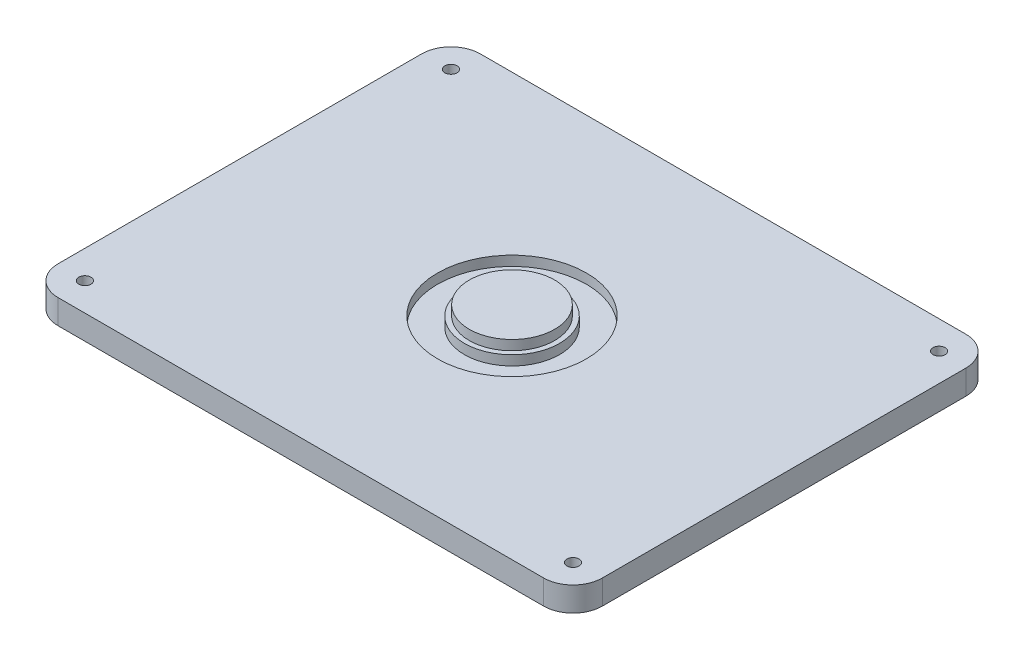
ISO-10303-21;
HEADER;
FILE_DESCRIPTION(('STEP AP214'),'2;1');
FILE_NAME('part.step','',(''),(''),'','','');
FILE_SCHEMA(('AUTOMOTIVE_DESIGN { 1 0 10303 214 1 1 1 1 }'));
ENDSEC;
DATA;
#1=APPLICATION_CONTEXT('core data for automotive mechanical design processes');
#2=APPLICATION_PROTOCOL_DEFINITION('international standard','automotive_design',2000,#1);
#3=PRODUCT_CONTEXT('',#1,'mechanical');
#4=PRODUCT('Part','Part','',(#3));
#5=PRODUCT_RELATED_PRODUCT_CATEGORY('part','',(#4));
#6=PRODUCT_DEFINITION_FORMATION('','',#4);
#7=PRODUCT_DEFINITION_CONTEXT('part definition',#1,'design');
#8=PRODUCT_DEFINITION('design','',#6,#7);
#9=PRODUCT_DEFINITION_SHAPE('','',#8);
#10=(LENGTH_UNIT() NAMED_UNIT(*) SI_UNIT(.MILLI.,.METRE.));
#11=(NAMED_UNIT(*) PLANE_ANGLE_UNIT() SI_UNIT($,.RADIAN.));
#12=(NAMED_UNIT(*) SI_UNIT($,.STERADIAN.) SOLID_ANGLE_UNIT());
#13=UNCERTAINTY_MEASURE_WITH_UNIT(LENGTH_MEASURE(1.E-05),#10,'distance_accuracy_value','');
#14=(GEOMETRIC_REPRESENTATION_CONTEXT(3) GLOBAL_UNCERTAINTY_ASSIGNED_CONTEXT((#13)) GLOBAL_UNIT_ASSIGNED_CONTEXT((#10,
#11,#12)) REPRESENTATION_CONTEXT('',''));
#15=CARTESIAN_POINT('',(0.,0.,0.));
#16=DIRECTION('',(0.,0.,1.));
#17=DIRECTION('',(1.,0.,0.));
#18=AXIS2_PLACEMENT_3D('',#15,#16,#17);
#19=CARTESIAN_POINT('',(99.5,-10.,74.5));
#20=DIRECTION('',(0.,1.,0.));
#21=DIRECTION('',(0.,0.,1.));
#22=AXIS2_PLACEMENT_3D('',#19,#20,#21);
#23=CYLINDRICAL_SURFACE('',#22,12.);
#24=CARTESIAN_POINT('',(99.5,0.,74.5));
#25=DIRECTION('',(0.,1.,0.));
#26=DIRECTION('',(0.,0.,1.));
#27=AXIS2_PLACEMENT_3D('',#24,#25,#26);
#28=CIRCLE('',#27,12.);
#29=CARTESIAN_POINT('',(99.4999999999999,0.,86.5));
#30=VERTEX_POINT('',#29);
#31=CARTESIAN_POINT('',(111.5,0.,74.4999999999999));
#32=VERTEX_POINT('',#31);
#33=EDGE_CURVE('E144',#30,#32,#28,.T.);
#34=ORIENTED_EDGE('',*,*,#33,.F.);
#35=DIRECTION('',(0.,1.,0.));
#36=VECTOR('',#35,1.);
#37=CARTESIAN_POINT('',(99.4999999999999,-10.,86.5));
#38=LINE('',#37,#36);
#39=CARTESIAN_POINT('',(99.4999999999999,-10.,86.5));
#40=VERTEX_POINT('',#39);
#41=EDGE_CURVE('E49',#40,#30,#38,.T.);
#42=ORIENTED_EDGE('',*,*,#41,.F.);
#43=CARTESIAN_POINT('',(99.5,-10.,74.5));
#44=DIRECTION('',(0.,1.,0.));
#45=DIRECTION('',(0.,0.,1.));
#46=AXIS2_PLACEMENT_3D('',#43,#44,#45);
#47=CIRCLE('',#46,12.);
#48=CARTESIAN_POINT('',(111.5,-10.,74.4999999999999));
#49=VERTEX_POINT('',#48);
#50=EDGE_CURVE('E174',#40,#49,#47,.T.);
#51=ORIENTED_EDGE('',*,*,#50,.T.);
#52=DIRECTION('',(0.,1.,0.));
#53=VECTOR('',#52,1.);
#54=CARTESIAN_POINT('',(111.5,-10.,74.4999999999999));
#55=LINE('',#54,#53);
#56=EDGE_CURVE('E42',#49,#32,#55,.T.);
#57=ORIENTED_EDGE('',*,*,#56,.T.);
#58=EDGE_LOOP('',(#34,#42,#51,#57));
#59=FACE_BOUND('',#58,.T.);
#60=ADVANCED_FACE('F39',(#59),#23,.T.);
#61=CARTESIAN_POINT('',(-99.4999999999999,-10.,86.5));
#62=DIRECTION('',(0.,0.,1.));
#63=DIRECTION('',(1.,0.,0.));
#64=AXIS2_PLACEMENT_3D('',#61,#62,#63);
#65=PLANE('',#64);
#66=DIRECTION('',(1.,0.,0.));
#67=VECTOR('',#66,1.);
#68=CARTESIAN_POINT('',(-99.4999999999999,0.,86.5));
#69=LINE('',#68,#67);
#70=CARTESIAN_POINT('',(-99.4999999999999,0.,86.5));
#71=VERTEX_POINT('',#70);
#72=EDGE_CURVE('E170',#71,#30,#69,.T.);
#73=ORIENTED_EDGE('',*,*,#72,.F.);
#74=DIRECTION('',(0.,1.,0.));
#75=VECTOR('',#74,1.);
#76=CARTESIAN_POINT('',(-99.4999999999999,-10.,86.5));
#77=LINE('',#76,#75);
#78=CARTESIAN_POINT('',(-99.4999999999999,-10.,86.5));
#79=VERTEX_POINT('',#78);
#80=EDGE_CURVE('E86',#79,#71,#77,.T.);
#81=ORIENTED_EDGE('',*,*,#80,.F.);
#82=DIRECTION('',(1.,0.,0.));
#83=VECTOR('',#82,1.);
#84=CARTESIAN_POINT('',(-99.4999999999999,-10.,86.5));
#85=LINE('',#84,#83);
#86=EDGE_CURVE('E130',#79,#40,#85,.T.);
#87=ORIENTED_EDGE('',*,*,#86,.T.);
#88=ORIENTED_EDGE('',*,*,#41,.T.);
#89=EDGE_LOOP('',(#73,#81,#87,#88));
#90=FACE_BOUND('',#89,.T.);
#91=ADVANCED_FACE('F193',(#90),#65,.T.);
#92=CARTESIAN_POINT('',(-99.5,-10.,74.5));
#93=DIRECTION('',(0.,1.,0.));
#94=DIRECTION('',(0.,0.,1.));
#95=AXIS2_PLACEMENT_3D('',#92,#93,#94);
#96=CYLINDRICAL_SURFACE('',#95,12.);
#97=CARTESIAN_POINT('',(-99.5,0.,74.5));
#98=DIRECTION('',(0.,1.,0.));
#99=DIRECTION('',(0.,0.,1.));
#100=AXIS2_PLACEMENT_3D('',#97,#98,#99);
#101=CIRCLE('',#100,12.);
#102=CARTESIAN_POINT('',(-111.5,0.,74.4999999999999));
#103=VERTEX_POINT('',#102);
#104=EDGE_CURVE('E116',#103,#71,#101,.T.);
#105=ORIENTED_EDGE('',*,*,#104,.F.);
#106=DIRECTION('',(0.,1.,0.));
#107=VECTOR('',#106,1.);
#108=CARTESIAN_POINT('',(-111.5,-10.,74.4999999999999));
#109=LINE('',#108,#107);
#110=CARTESIAN_POINT('',(-111.5,-10.,74.4999999999999));
#111=VERTEX_POINT('',#110);
#112=EDGE_CURVE('E111',#111,#103,#109,.T.);
#113=ORIENTED_EDGE('',*,*,#112,.F.);
#114=CARTESIAN_POINT('',(-99.5,-10.,74.5));
#115=DIRECTION('',(0.,1.,0.));
#116=DIRECTION('',(0.,0.,1.));
#117=AXIS2_PLACEMENT_3D('',#114,#115,#116);
#118=CIRCLE('',#117,12.);
#119=EDGE_CURVE('E114',#111,#79,#118,.T.);
#120=ORIENTED_EDGE('',*,*,#119,.T.);
#121=ORIENTED_EDGE('',*,*,#80,.T.);
#122=EDGE_LOOP('',(#105,#113,#120,#121));
#123=FACE_BOUND('',#122,.T.);
#124=ADVANCED_FACE('F113',(#123),#96,.T.);
#125=CARTESIAN_POINT('',(-111.5,-10.,-74.4999999999999));
#126=DIRECTION('',(-1.,0.,0.));
#127=DIRECTION('',(0.,0.,1.));
#128=AXIS2_PLACEMENT_3D('',#125,#126,#127);
#129=PLANE('',#128);
#130=DIRECTION('',(0.,0.,1.));
#131=VECTOR('',#130,1.);
#132=CARTESIAN_POINT('',(-111.5,0.,-74.4999999999999));
#133=LINE('',#132,#131);
#134=CARTESIAN_POINT('',(-111.5,0.,-74.4999999999999));
#135=VERTEX_POINT('',#134);
#136=EDGE_CURVE('E165',#135,#103,#133,.T.);
#137=ORIENTED_EDGE('',*,*,#136,.F.);
#138=DIRECTION('',(0.,1.,0.));
#139=VECTOR('',#138,1.);
#140=CARTESIAN_POINT('',(-111.5,-10.,-74.4999999999999));
#141=LINE('',#140,#139);
#142=CARTESIAN_POINT('',(-111.5,-10.,-74.4999999999999));
#143=VERTEX_POINT('',#142);
#144=EDGE_CURVE('E122',#143,#135,#141,.T.);
#145=ORIENTED_EDGE('',*,*,#144,.F.);
#146=DIRECTION('',(0.,0.,1.));
#147=VECTOR('',#146,1.);
#148=CARTESIAN_POINT('',(-111.5,-10.,-74.4999999999999));
#149=LINE('',#148,#147);
#150=EDGE_CURVE('E128',#143,#111,#149,.T.);
#151=ORIENTED_EDGE('',*,*,#150,.T.);
#152=ORIENTED_EDGE('',*,*,#112,.T.);
#153=EDGE_LOOP('',(#137,#145,#151,#152));
#154=FACE_BOUND('',#153,.T.);
#155=ADVANCED_FACE('F133',(#154),#129,.T.);
#156=CARTESIAN_POINT('',(-99.5,-10.,-74.5));
#157=DIRECTION('',(0.,1.,0.));
#158=DIRECTION('',(0.,0.,1.));
#159=AXIS2_PLACEMENT_3D('',#156,#157,#158);
#160=CYLINDRICAL_SURFACE('',#159,12.);
#161=CARTESIAN_POINT('',(-99.5,0.,-74.5));
#162=DIRECTION('',(0.,1.,0.));
#163=DIRECTION('',(0.,0.,1.));
#164=AXIS2_PLACEMENT_3D('',#161,#162,#163);
#165=CIRCLE('',#164,12.);
#166=CARTESIAN_POINT('',(-99.4999999999999,0.,-86.5));
#167=VERTEX_POINT('',#166);
#168=EDGE_CURVE('E161',#167,#135,#165,.T.);
#169=ORIENTED_EDGE('',*,*,#168,.F.);
#170=DIRECTION('',(0.,1.,0.));
#171=VECTOR('',#170,1.);
#172=CARTESIAN_POINT('',(-99.4999999999999,-10.,-86.5));
#173=LINE('',#172,#171);
#174=CARTESIAN_POINT('',(-99.4999999999999,-10.,-86.5));
#175=VERTEX_POINT('',#174);
#176=EDGE_CURVE('E181',#175,#167,#173,.T.);
#177=ORIENTED_EDGE('',*,*,#176,.F.);
#178=CARTESIAN_POINT('',(-99.5,-10.,-74.5));
#179=DIRECTION('',(0.,1.,0.));
#180=DIRECTION('',(0.,0.,1.));
#181=AXIS2_PLACEMENT_3D('',#178,#179,#180);
#182=CIRCLE('',#181,12.);
#183=EDGE_CURVE('E135',#175,#143,#182,.T.);
#184=ORIENTED_EDGE('',*,*,#183,.T.);
#185=ORIENTED_EDGE('',*,*,#144,.T.);
#186=EDGE_LOOP('',(#169,#177,#184,#185));
#187=FACE_BOUND('',#186,.T.);
#188=ADVANCED_FACE('F206',(#187),#160,.T.);
#189=CARTESIAN_POINT('',(-99.4999999999999,-10.,-86.5));
#190=DIRECTION('',(0.,0.,-1.));
#191=DIRECTION('',(-1.,0.,0.));
#192=AXIS2_PLACEMENT_3D('',#189,#190,#191);
#193=PLANE('',#192);
#194=DIRECTION('',(-1.,0.,0.));
#195=VECTOR('',#194,1.);
#196=CARTESIAN_POINT('',(-99.4999999999999,0.,-86.5));
#197=LINE('',#196,#195);
#198=CARTESIAN_POINT('',(99.4999999999999,0.,-86.5));
#199=VERTEX_POINT('',#198);
#200=EDGE_CURVE('E157',#199,#167,#197,.T.);
#201=ORIENTED_EDGE('',*,*,#200,.F.);
#202=DIRECTION('',(0.,1.,0.));
#203=VECTOR('',#202,1.);
#204=CARTESIAN_POINT('',(99.4999999999999,-10.,-86.5));
#205=LINE('',#204,#203);
#206=CARTESIAN_POINT('',(99.4999999999999,-10.,-86.5));
#207=VERTEX_POINT('',#206);
#208=EDGE_CURVE('E184',#207,#199,#205,.T.);
#209=ORIENTED_EDGE('',*,*,#208,.F.);
#210=DIRECTION('',(-1.,0.,0.));
#211=VECTOR('',#210,1.);
#212=CARTESIAN_POINT('',(-99.4999999999999,-10.,-86.5));
#213=LINE('',#212,#211);
#214=EDGE_CURVE('E138',#207,#175,#213,.T.);
#215=ORIENTED_EDGE('',*,*,#214,.T.);
#216=ORIENTED_EDGE('',*,*,#176,.T.);
#217=EDGE_LOOP('',(#201,#209,#215,#216));
#218=FACE_BOUND('',#217,.T.);
#219=ADVANCED_FACE('F209',(#218),#193,.T.);
#220=CARTESIAN_POINT('',(99.5,-10.,-74.5));
#221=DIRECTION('',(0.,1.,0.));
#222=DIRECTION('',(0.,0.,1.));
#223=AXIS2_PLACEMENT_3D('',#220,#221,#222);
#224=CYLINDRICAL_SURFACE('',#223,12.);
#225=CARTESIAN_POINT('',(99.5,0.,-74.5));
#226=DIRECTION('',(0.,1.,0.));
#227=DIRECTION('',(0.,0.,-1.));
#228=AXIS2_PLACEMENT_3D('',#225,#226,#227);
#229=CIRCLE('',#228,12.);
#230=CARTESIAN_POINT('',(111.5,0.,-74.4999999999999));
#231=VERTEX_POINT('',#230);
#232=EDGE_CURVE('E153',#231,#199,#229,.T.);
#233=ORIENTED_EDGE('',*,*,#232,.F.);
#234=DIRECTION('',(0.,1.,0.));
#235=VECTOR('',#234,1.);
#236=CARTESIAN_POINT('',(111.5,-10.,-74.4999999999999));
#237=LINE('',#236,#235);
#238=CARTESIAN_POINT('',(111.5,-10.,-74.4999999999999));
#239=VERTEX_POINT('',#238);
#240=EDGE_CURVE('E186',#239,#231,#237,.T.);
#241=ORIENTED_EDGE('',*,*,#240,.F.);
#242=CARTESIAN_POINT('',(99.5,-10.,-74.5));
#243=DIRECTION('',(0.,1.,0.));
#244=DIRECTION('',(0.,0.,-1.));
#245=AXIS2_PLACEMENT_3D('',#242,#243,#244);
#246=CIRCLE('',#245,12.);
#247=EDGE_CURVE('E324',#239,#207,#246,.T.);
#248=ORIENTED_EDGE('',*,*,#247,.T.);
#249=ORIENTED_EDGE('',*,*,#208,.T.);
#250=EDGE_LOOP('',(#233,#241,#248,#249));
#251=FACE_BOUND('',#250,.T.);
#252=ADVANCED_FACE('F213',(#251),#224,.T.);
#253=CARTESIAN_POINT('',(111.5,-10.,-74.4999999999999));
#254=DIRECTION('',(1.,0.,0.));
#255=DIRECTION('',(0.,0.,-1.));
#256=AXIS2_PLACEMENT_3D('',#253,#254,#255);
#257=PLANE('',#256);
#258=DIRECTION('',(0.,0.,-1.));
#259=VECTOR('',#258,1.);
#260=CARTESIAN_POINT('',(111.5,0.,-74.4999999999999));
#261=LINE('',#260,#259);
#262=EDGE_CURVE('E148',#32,#231,#261,.T.);
#263=ORIENTED_EDGE('',*,*,#262,.F.);
#264=ORIENTED_EDGE('',*,*,#56,.F.);
#265=DIRECTION('',(0.,0.,-1.));
#266=VECTOR('',#265,1.);
#267=CARTESIAN_POINT('',(111.5,-10.,-74.4999999999999));
#268=LINE('',#267,#266);
#269=EDGE_CURVE('E321',#49,#239,#268,.T.);
#270=ORIENTED_EDGE('',*,*,#269,.T.);
#271=ORIENTED_EDGE('',*,*,#240,.T.);
#272=EDGE_LOOP('',(#263,#264,#270,#271));
#273=FACE_BOUND('',#272,.T.);
#274=ADVANCED_FACE('F190',(#273),#257,.T.);
#275=CARTESIAN_POINT('',(99.5,-10.,74.5));
#276=DIRECTION('',(0.,1.,0.));
#277=DIRECTION('',(0.,0.,1.));
#278=AXIS2_PLACEMENT_3D('',#275,#276,#277);
#279=PLANE('',#278);
#280=CARTESIAN_POINT('',(-100.,-10.,-75.));
#281=DIRECTION('',(0.,1.,0.));
#282=DIRECTION('',(0.,0.,1.));
#283=AXIS2_PLACEMENT_3D('',#280,#281,#282);
#284=CIRCLE('',#283,2.5);
#285=CARTESIAN_POINT('',(-100.,-10.,-72.5));
#286=VERTEX_POINT('',#285);
#287=EDGE_CURVE('E290',#286,#286,#284,.T.);
#288=ORIENTED_EDGE('',*,*,#287,.T.);
#289=EDGE_LOOP('',(#288));
#290=FACE_BOUND('',#289,.T.);
#291=CARTESIAN_POINT('',(-100.,-10.,75.));
#292=DIRECTION('',(0.,1.,0.));
#293=DIRECTION('',(0.,0.,1.));
#294=AXIS2_PLACEMENT_3D('',#291,#292,#293);
#295=CIRCLE('',#294,2.5);
#296=CARTESIAN_POINT('',(-100.,-10.,77.5));
#297=VERTEX_POINT('',#296);
#298=EDGE_CURVE('E297',#297,#297,#295,.T.);
#299=ORIENTED_EDGE('',*,*,#298,.T.);
#300=EDGE_LOOP('',(#299));
#301=FACE_BOUND('',#300,.T.);
#302=CARTESIAN_POINT('',(100.,-10.,75.));
#303=DIRECTION('',(0.,1.,0.));
#304=DIRECTION('',(0.,0.,1.));
#305=AXIS2_PLACEMENT_3D('',#302,#303,#304);
#306=CIRCLE('',#305,2.50000000000001);
#307=CARTESIAN_POINT('',(100.,-10.,77.5));
#308=VERTEX_POINT('',#307);
#309=EDGE_CURVE('E305',#308,#308,#306,.T.);
#310=ORIENTED_EDGE('',*,*,#309,.T.);
#311=EDGE_LOOP('',(#310));
#312=FACE_BOUND('',#311,.T.);
#313=CARTESIAN_POINT('',(100.,-10.,-75.));
#314=DIRECTION('',(0.,1.,0.));
#315=DIRECTION('',(0.,0.,1.));
#316=AXIS2_PLACEMENT_3D('',#313,#314,#315);
#317=CIRCLE('',#316,2.5);
#318=CARTESIAN_POINT('',(100.,-10.,-72.5));
#319=VERTEX_POINT('',#318);
#320=EDGE_CURVE('E149',#319,#319,#317,.T.);
#321=ORIENTED_EDGE('',*,*,#320,.T.);
#322=EDGE_LOOP('',(#321));
#323=FACE_BOUND('',#322,.T.);
#324=ORIENTED_EDGE('',*,*,#50,.F.);
#325=ORIENTED_EDGE('',*,*,#86,.F.);
#326=ORIENTED_EDGE('',*,*,#119,.F.);
#327=ORIENTED_EDGE('',*,*,#150,.F.);
#328=ORIENTED_EDGE('',*,*,#183,.F.);
#329=ORIENTED_EDGE('',*,*,#214,.F.);
#330=ORIENTED_EDGE('',*,*,#247,.F.);
#331=ORIENTED_EDGE('',*,*,#269,.F.);
#332=EDGE_LOOP('',(#324,#325,#326,#327,#328,#329,#330,#331));
#333=FACE_BOUND('',#332,.T.);
#334=ADVANCED_FACE('F126',(#290,#301,#312,#323,#333),#279,.F.);
#335=CARTESIAN_POINT('',(99.5,0.,74.5));
#336=DIRECTION('',(0.,1.,0.));
#337=DIRECTION('',(0.,0.,1.));
#338=AXIS2_PLACEMENT_3D('',#335,#336,#337);
#339=PLANE('',#338);
#340=CARTESIAN_POINT('',(0.,0.,0.));
#341=DIRECTION('',(0.,1.,0.));
#342=DIRECTION('',(0.,0.,1.));
#343=AXIS2_PLACEMENT_3D('',#340,#341,#342);
#344=CIRCLE('',#343,30.5);
#345=CARTESIAN_POINT('',(0.,0.,30.5));
#346=VERTEX_POINT('',#345);
#347=EDGE_CURVE('E280',#346,#346,#344,.T.);
#348=ORIENTED_EDGE('',*,*,#347,.F.);
#349=EDGE_LOOP('',(#348));
#350=FACE_BOUND('',#349,.T.);
#351=CARTESIAN_POINT('',(-100.,0.,-75.));
#352=DIRECTION('',(0.,1.,0.));
#353=DIRECTION('',(0.,0.,1.));
#354=AXIS2_PLACEMENT_3D('',#351,#352,#353);
#355=CIRCLE('',#354,2.5);
#356=CARTESIAN_POINT('',(-100.,0.,-72.5));
#357=VERTEX_POINT('',#356);
#358=EDGE_CURVE('E286',#357,#357,#355,.T.);
#359=ORIENTED_EDGE('',*,*,#358,.F.);
#360=EDGE_LOOP('',(#359));
#361=FACE_BOUND('',#360,.T.);
#362=CARTESIAN_POINT('',(-100.,0.,75.));
#363=DIRECTION('',(0.,1.,0.));
#364=DIRECTION('',(0.,0.,1.));
#365=AXIS2_PLACEMENT_3D('',#362,#363,#364);
#366=CIRCLE('',#365,2.5);
#367=CARTESIAN_POINT('',(-100.,0.,77.5));
#368=VERTEX_POINT('',#367);
#369=EDGE_CURVE('E293',#368,#368,#366,.T.);
#370=ORIENTED_EDGE('',*,*,#369,.F.);
#371=EDGE_LOOP('',(#370));
#372=FACE_BOUND('',#371,.T.);
#373=CARTESIAN_POINT('',(100.,0.,75.));
#374=DIRECTION('',(0.,1.,0.));
#375=DIRECTION('',(0.,0.,1.));
#376=AXIS2_PLACEMENT_3D('',#373,#374,#375);
#377=CIRCLE('',#376,2.50000000000001);
#378=CARTESIAN_POINT('',(100.,0.,77.5));
#379=VERTEX_POINT('',#378);
#380=EDGE_CURVE('E301',#379,#379,#377,.T.);
#381=ORIENTED_EDGE('',*,*,#380,.F.);
#382=EDGE_LOOP('',(#381));
#383=FACE_BOUND('',#382,.T.);
#384=CARTESIAN_POINT('',(100.,0.,-75.));
#385=DIRECTION('',(0.,1.,0.));
#386=DIRECTION('',(0.,0.,1.));
#387=AXIS2_PLACEMENT_3D('',#384,#385,#386);
#388=CIRCLE('',#387,2.5);
#389=CARTESIAN_POINT('',(100.,0.,-72.5));
#390=VERTEX_POINT('',#389);
#391=EDGE_CURVE('E309',#390,#390,#388,.T.);
#392=ORIENTED_EDGE('',*,*,#391,.F.);
#393=EDGE_LOOP('',(#392));
#394=FACE_BOUND('',#393,.T.);
#395=ORIENTED_EDGE('',*,*,#33,.T.);
#396=ORIENTED_EDGE('',*,*,#262,.T.);
#397=ORIENTED_EDGE('',*,*,#232,.T.);
#398=ORIENTED_EDGE('',*,*,#200,.T.);
#399=ORIENTED_EDGE('',*,*,#168,.T.);
#400=ORIENTED_EDGE('',*,*,#136,.T.);
#401=ORIENTED_EDGE('',*,*,#104,.T.);
#402=ORIENTED_EDGE('',*,*,#72,.T.);
#403=EDGE_LOOP('',(#395,#396,#397,#398,#399,#400,#401,#402));
#404=FACE_BOUND('',#403,.T.);
#405=ADVANCED_FACE('F192',(#350,#361,#372,#383,#394,#404),#339,.T.);
#406=CARTESIAN_POINT('',(100.,-10.,-75.));
#407=DIRECTION('',(0.,1.,0.));
#408=DIRECTION('',(0.,0.,1.));
#409=AXIS2_PLACEMENT_3D('',#406,#407,#408);
#410=CYLINDRICAL_SURFACE('',#409,2.5);
#411=ORIENTED_EDGE('',*,*,#320,.F.);
#412=EDGE_LOOP('',(#411));
#413=FACE_BOUND('',#412,.T.);
#414=ORIENTED_EDGE('',*,*,#391,.T.);
#415=EDGE_LOOP('',(#414));
#416=FACE_BOUND('',#415,.T.);
#417=ADVANCED_FACE('F225',(#413,#416),#410,.F.);
#418=CARTESIAN_POINT('',(100.,-10.,75.));
#419=DIRECTION('',(0.,1.,0.));
#420=DIRECTION('',(0.,0.,1.));
#421=AXIS2_PLACEMENT_3D('',#418,#419,#420);
#422=CYLINDRICAL_SURFACE('',#421,2.50000000000001);
#423=ORIENTED_EDGE('',*,*,#309,.F.);
#424=EDGE_LOOP('',(#423));
#425=FACE_BOUND('',#424,.T.);
#426=ORIENTED_EDGE('',*,*,#380,.T.);
#427=EDGE_LOOP('',(#426));
#428=FACE_BOUND('',#427,.T.);
#429=ADVANCED_FACE('F233',(#425,#428),#422,.F.);
#430=CARTESIAN_POINT('',(-100.,-10.,75.));
#431=DIRECTION('',(0.,1.,0.));
#432=DIRECTION('',(0.,0.,1.));
#433=AXIS2_PLACEMENT_3D('',#430,#431,#432);
#434=CYLINDRICAL_SURFACE('',#433,2.5);
#435=ORIENTED_EDGE('',*,*,#298,.F.);
#436=EDGE_LOOP('',(#435));
#437=FACE_BOUND('',#436,.T.);
#438=ORIENTED_EDGE('',*,*,#369,.T.);
#439=EDGE_LOOP('',(#438));
#440=FACE_BOUND('',#439,.T.);
#441=ADVANCED_FACE('F237',(#437,#440),#434,.F.);
#442=CARTESIAN_POINT('',(-100.,-10.,-75.));
#443=DIRECTION('',(0.,1.,0.));
#444=DIRECTION('',(0.,0.,1.));
#445=AXIS2_PLACEMENT_3D('',#442,#443,#444);
#446=CYLINDRICAL_SURFACE('',#445,2.5);
#447=ORIENTED_EDGE('',*,*,#287,.F.);
#448=EDGE_LOOP('',(#447));
#449=FACE_BOUND('',#448,.T.);
#450=ORIENTED_EDGE('',*,*,#358,.T.);
#451=EDGE_LOOP('',(#450));
#452=FACE_BOUND('',#451,.T.);
#453=ADVANCED_FACE('F241',(#449,#452),#446,.F.);
#454=CARTESIAN_POINT('',(0.,-4.,0.));
#455=DIRECTION('',(0.,1.,0.));
#456=DIRECTION('',(0.,0.,1.));
#457=AXIS2_PLACEMENT_3D('',#454,#455,#456);
#458=CYLINDRICAL_SURFACE('',#457,30.5);
#459=CARTESIAN_POINT('',(0.,-4.,0.));
#460=DIRECTION('',(0.,1.,0.));
#461=DIRECTION('',(0.,0.,1.));
#462=AXIS2_PLACEMENT_3D('',#459,#460,#461);
#463=CIRCLE('',#462,30.5);
#464=CARTESIAN_POINT('',(0.,-4.,30.5));
#465=VERTEX_POINT('',#464);
#466=EDGE_CURVE('E282',#465,#465,#463,.T.);
#467=ORIENTED_EDGE('',*,*,#466,.F.);
#468=EDGE_LOOP('',(#467));
#469=FACE_BOUND('',#468,.T.);
#470=ORIENTED_EDGE('',*,*,#347,.T.);
#471=EDGE_LOOP('',(#470));
#472=FACE_BOUND('',#471,.T.);
#473=ADVANCED_FACE('F245',(#469,#472),#458,.F.);
#474=CARTESIAN_POINT('',(0.,-4.,0.));
#475=DIRECTION('',(0.,1.,0.));
#476=DIRECTION('',(0.,0.,1.));
#477=AXIS2_PLACEMENT_3D('',#474,#475,#476);
#478=PLANE('',#477);
#479=CARTESIAN_POINT('',(0.,-4.,0.));
#480=DIRECTION('',(0.,1.,0.));
#481=DIRECTION('',(0.,0.,1.));
#482=AXIS2_PLACEMENT_3D('',#479,#480,#481);
#483=CIRCLE('',#482,19.5);
#484=CARTESIAN_POINT('',(0.,-4.,19.5));
#485=VERTEX_POINT('',#484);
#486=EDGE_CURVE('E275',#485,#485,#483,.T.);
#487=ORIENTED_EDGE('',*,*,#486,.F.);
#488=EDGE_LOOP('',(#487));
#489=FACE_BOUND('',#488,.T.);
#490=ORIENTED_EDGE('',*,*,#466,.T.);
#491=EDGE_LOOP('',(#490));
#492=FACE_BOUND('',#491,.T.);
#493=ADVANCED_FACE('F249',(#489,#492),#478,.T.);
#494=CARTESIAN_POINT('',(0.,-4.,0.));
#495=DIRECTION('',(0.,1.,0.));
#496=DIRECTION('',(0.,0.,1.));
#497=AXIS2_PLACEMENT_3D('',#494,#495,#496);
#498=CYLINDRICAL_SURFACE('',#497,19.5);
#499=ORIENTED_EDGE('',*,*,#486,.T.);
#500=EDGE_LOOP('',(#499));
#501=FACE_BOUND('',#500,.T.);
#502=CARTESIAN_POINT('',(0.,0.,0.));
#503=DIRECTION('',(0.,1.,0.));
#504=DIRECTION('',(0.,0.,1.));
#505=AXIS2_PLACEMENT_3D('',#502,#503,#504);
#506=CIRCLE('',#505,19.5);
#507=CARTESIAN_POINT('',(0.,0.,19.5));
#508=VERTEX_POINT('',#507);
#509=EDGE_CURVE('E271',#508,#508,#506,.T.);
#510=ORIENTED_EDGE('',*,*,#509,.F.);
#511=EDGE_LOOP('',(#510));
#512=FACE_BOUND('',#511,.T.);
#513=ADVANCED_FACE('F253',(#501,#512),#498,.T.);
#514=CARTESIAN_POINT('',(0.,0.,0.));
#515=DIRECTION('',(0.,1.,0.));
#516=DIRECTION('',(0.,0.,1.));
#517=AXIS2_PLACEMENT_3D('',#514,#515,#516);
#518=CIRCLE('',#517,17.5);
#519=CARTESIAN_POINT('',(0.,0.,17.5));
#520=VERTEX_POINT('',#519);
#521=EDGE_CURVE('E11',#520,#520,#518,.T.);
#522=ORIENTED_EDGE('',*,*,#521,.F.);
#523=EDGE_LOOP('',(#522));
#524=FACE_BOUND('',#523,.T.);
#525=ORIENTED_EDGE('',*,*,#509,.T.);
#526=EDGE_LOOP('',(#525));
#527=FACE_BOUND('',#526,.T.);
#528=ADVANCED_FACE('F227',(#524,#527),#339,.T.);
#529=CARTESIAN_POINT('',(0.,4.,0.));
#530=DIRECTION('',(0.,-1.,0.));
#531=DIRECTION('',(0.,0.,-1.));
#532=AXIS2_PLACEMENT_3D('',#529,#530,#531);
#533=CYLINDRICAL_SURFACE('',#532,17.5);
#534=CARTESIAN_POINT('',(0.,4.,0.));
#535=DIRECTION('',(0.,1.,0.));
#536=DIRECTION('',(0.,0.,1.));
#537=AXIS2_PLACEMENT_3D('',#534,#535,#536);
#538=CIRCLE('',#537,17.5);
#539=CARTESIAN_POINT('',(0.,4.,17.5));
#540=VERTEX_POINT('',#539);
#541=EDGE_CURVE('E269',#540,#540,#538,.T.);
#542=ORIENTED_EDGE('',*,*,#541,.F.);
#543=EDGE_LOOP('',(#542));
#544=FACE_BOUND('',#543,.T.);
#545=ORIENTED_EDGE('',*,*,#521,.T.);
#546=EDGE_LOOP('',(#545));
#547=FACE_BOUND('',#546,.T.);
#548=ADVANCED_FACE('F258',(#544,#547),#533,.T.);
#549=CARTESIAN_POINT('',(0.,4.,0.));
#550=DIRECTION('',(0.,1.,0.));
#551=DIRECTION('',(0.,0.,1.));
#552=AXIS2_PLACEMENT_3D('',#549,#550,#551);
#553=PLANE('',#552);
#554=ORIENTED_EDGE('',*,*,#541,.T.);
#555=EDGE_LOOP('',(#554));
#556=FACE_BOUND('',#555,.T.);
#557=ADVANCED_FACE('F261',(#556),#553,.T.);
#558=CLOSED_SHELL('',(#60,#91,#124,#155,#188,#219,#252,#274,#334,#405,#417,#429,#441,#453,#473,
#493,#513,#528,#548,#557));
#559=MANIFOLD_SOLID_BREP('B2',#558);
#560=ADVANCED_BREP_SHAPE_REPRESENTATION('',(#18,#559),#14);
#561=SHAPE_DEFINITION_REPRESENTATION(#9,#560);
ENDSEC;
END-ISO-10303-21;
